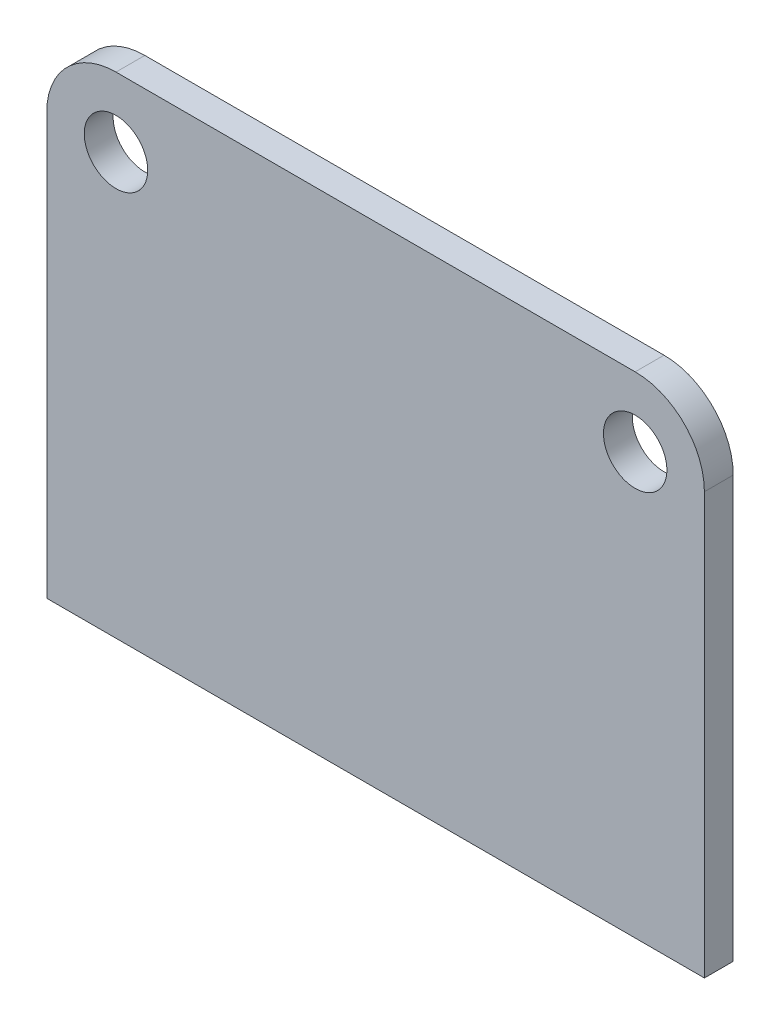
ISO-10303-21;
HEADER;
FILE_DESCRIPTION(('STEP AP214'),'2;1');
FILE_NAME('part.step','',(''),(''),'','','');
FILE_SCHEMA(('AUTOMOTIVE_DESIGN { 1 0 10303 214 1 1 1 1 }'));
ENDSEC;
DATA;
#1=APPLICATION_CONTEXT('core data for automotive mechanical design processes');
#2=APPLICATION_PROTOCOL_DEFINITION('international standard','automotive_design',2000,#1);
#3=PRODUCT_CONTEXT('',#1,'mechanical');
#4=PRODUCT('Part','Part','',(#3));
#5=PRODUCT_RELATED_PRODUCT_CATEGORY('part','',(#4));
#6=PRODUCT_DEFINITION_FORMATION('','',#4);
#7=PRODUCT_DEFINITION_CONTEXT('part definition',#1,'design');
#8=PRODUCT_DEFINITION('design','',#6,#7);
#9=PRODUCT_DEFINITION_SHAPE('','',#8);
#10=(LENGTH_UNIT() NAMED_UNIT(*) SI_UNIT(.MILLI.,.METRE.));
#11=(NAMED_UNIT(*) PLANE_ANGLE_UNIT() SI_UNIT($,.RADIAN.));
#12=(NAMED_UNIT(*) SI_UNIT($,.STERADIAN.) SOLID_ANGLE_UNIT());
#13=UNCERTAINTY_MEASURE_WITH_UNIT(LENGTH_MEASURE(1.E-05),#10,'distance_accuracy_value','');
#14=(GEOMETRIC_REPRESENTATION_CONTEXT(3) GLOBAL_UNCERTAINTY_ASSIGNED_CONTEXT((#13)) GLOBAL_UNIT_ASSIGNED_CONTEXT((#10,
#11,#12)) REPRESENTATION_CONTEXT('',''));
#15=CARTESIAN_POINT('',(0.,0.,0.));
#16=DIRECTION('',(0.,0.,1.));
#17=DIRECTION('',(1.,0.,0.));
#18=AXIS2_PLACEMENT_3D('',#15,#16,#17);
#19=CARTESIAN_POINT('',(9.,11.1,-0.5));
#20=DIRECTION('',(0.,0.,1.));
#21=DIRECTION('',(1.,0.,0.));
#22=AXIS2_PLACEMENT_3D('',#19,#20,#21);
#23=PLANE('',#22);
#24=DIRECTION('',(-1.,0.,0.));
#25=VECTOR('',#24,1.);
#26=CARTESIAN_POINT('',(11.4,-3.49999999999999,-0.5));
#27=LINE('',#26,#25);
#28=CARTESIAN_POINT('',(11.4,-3.49999999999999,-0.5));
#29=VERTEX_POINT('',#28);
#30=CARTESIAN_POINT('',(-11.4,-3.5,-0.5));
#31=VERTEX_POINT('',#30);
#32=EDGE_CURVE('E100',#29,#31,#27,.T.);
#33=ORIENTED_EDGE('',*,*,#32,.T.);
#34=DIRECTION('',(0.,1.,0.));
#35=VECTOR('',#34,1.);
#36=CARTESIAN_POINT('',(-11.4,-3.5,-0.5));
#37=LINE('',#36,#35);
#38=CARTESIAN_POINT('',(-11.4,11.1,-0.5));
#39=VERTEX_POINT('',#38);
#40=EDGE_CURVE('E111',#31,#39,#37,.T.);
#41=ORIENTED_EDGE('',*,*,#40,.T.);
#42=CARTESIAN_POINT('',(-9.,11.1,-0.5));
#43=DIRECTION('',(0.,0.,-1.));
#44=DIRECTION('',(-1.,0.,0.));
#45=AXIS2_PLACEMENT_3D('',#42,#43,#44);
#46=CIRCLE('',#45,2.4);
#47=CARTESIAN_POINT('',(-9.,13.5,-0.5));
#48=VERTEX_POINT('',#47);
#49=EDGE_CURVE('E83',#48,#39,#46,.F.);
#50=ORIENTED_EDGE('',*,*,#49,.F.);
#51=DIRECTION('',(1.,0.,0.));
#52=VECTOR('',#51,1.);
#53=CARTESIAN_POINT('',(9.,13.5,-0.5));
#54=LINE('',#53,#52);
#55=CARTESIAN_POINT('',(9.,13.5,-0.5));
#56=VERTEX_POINT('',#55);
#57=EDGE_CURVE('E79',#48,#56,#54,.T.);
#58=ORIENTED_EDGE('',*,*,#57,.T.);
#59=CARTESIAN_POINT('',(9.,11.1,-0.5));
#60=DIRECTION('',(0.,0.,-1.));
#61=DIRECTION('',(-1.,0.,0.));
#62=AXIS2_PLACEMENT_3D('',#59,#60,#61);
#63=CIRCLE('',#62,2.4);
#64=CARTESIAN_POINT('',(11.4,11.1,-0.5));
#65=VERTEX_POINT('',#64);
#66=EDGE_CURVE('E66',#65,#56,#63,.F.);
#67=ORIENTED_EDGE('',*,*,#66,.F.);
#68=DIRECTION('',(0.,-1.,0.));
#69=VECTOR('',#68,1.);
#70=CARTESIAN_POINT('',(11.4,-3.49999999999999,-0.5));
#71=LINE('',#70,#69);
#72=EDGE_CURVE('E76',#65,#29,#71,.T.);
#73=ORIENTED_EDGE('',*,*,#72,.T.);
#74=EDGE_LOOP('',(#33,#41,#50,#58,#67,#73));
#75=FACE_BOUND('',#74,.T.);
#76=CARTESIAN_POINT('',(9.,11.1,-0.5));
#77=DIRECTION('',(0.,0.,1.));
#78=DIRECTION('',(1.,0.,0.));
#79=AXIS2_PLACEMENT_3D('',#76,#77,#78);
#80=CIRCLE('',#79,1.1);
#81=CARTESIAN_POINT('',(10.1,11.1,-0.5));
#82=VERTEX_POINT('',#81);
#83=EDGE_CURVE('E104',#82,#82,#80,.T.);
#84=ORIENTED_EDGE('',*,*,#83,.T.);
#85=EDGE_LOOP('',(#84));
#86=FACE_BOUND('',#85,.T.);
#87=CARTESIAN_POINT('',(-9.,11.1,-0.5));
#88=DIRECTION('',(0.,0.,1.));
#89=DIRECTION('',(1.,0.,0.));
#90=AXIS2_PLACEMENT_3D('',#87,#88,#89);
#91=CIRCLE('',#90,1.1);
#92=CARTESIAN_POINT('',(-7.9,11.1,-0.5));
#93=VERTEX_POINT('',#92);
#94=EDGE_CURVE('E20',#93,#93,#91,.T.);
#95=ORIENTED_EDGE('',*,*,#94,.T.);
#96=EDGE_LOOP('',(#95));
#97=FACE_BOUND('',#96,.T.);
#98=ADVANCED_FACE('F17',(#75,#86,#97),#23,.F.);
#99=CARTESIAN_POINT('',(-9.,11.1,0.5));
#100=DIRECTION('',(0.,0.,1.));
#101=DIRECTION('',(1.,0.,0.));
#102=AXIS2_PLACEMENT_3D('',#99,#100,#101);
#103=CYLINDRICAL_SURFACE('',#102,1.1);
#104=ORIENTED_EDGE('',*,*,#94,.F.);
#105=EDGE_LOOP('',(#104));
#106=FACE_BOUND('',#105,.T.);
#107=CARTESIAN_POINT('',(-9.,11.1,0.5));
#108=DIRECTION('',(0.,0.,1.));
#109=DIRECTION('',(1.,0.,0.));
#110=AXIS2_PLACEMENT_3D('',#107,#108,#109);
#111=CIRCLE('',#110,1.1);
#112=CARTESIAN_POINT('',(-7.9,11.1,0.5));
#113=VERTEX_POINT('',#112);
#114=EDGE_CURVE('E108',#113,#113,#111,.F.);
#115=ORIENTED_EDGE('',*,*,#114,.F.);
#116=EDGE_LOOP('',(#115));
#117=FACE_BOUND('',#116,.T.);
#118=ADVANCED_FACE('F133',(#106,#117),#103,.F.);
#119=CARTESIAN_POINT('',(9.,11.1,0.5));
#120=DIRECTION('',(0.,0.,1.));
#121=DIRECTION('',(1.,0.,0.));
#122=AXIS2_PLACEMENT_3D('',#119,#120,#121);
#123=CYLINDRICAL_SURFACE('',#122,1.1);
#124=ORIENTED_EDGE('',*,*,#83,.F.);
#125=EDGE_LOOP('',(#124));
#126=FACE_BOUND('',#125,.T.);
#127=CARTESIAN_POINT('',(9.,11.1,0.5));
#128=DIRECTION('',(0.,0.,1.));
#129=DIRECTION('',(1.,0.,0.));
#130=AXIS2_PLACEMENT_3D('',#127,#128,#129);
#131=CIRCLE('',#130,1.1);
#132=CARTESIAN_POINT('',(10.1,11.1,0.5));
#133=VERTEX_POINT('',#132);
#134=EDGE_CURVE('E122',#133,#133,#131,.F.);
#135=ORIENTED_EDGE('',*,*,#134,.F.);
#136=EDGE_LOOP('',(#135));
#137=FACE_BOUND('',#136,.T.);
#138=ADVANCED_FACE('F136',(#126,#137),#123,.F.);
#139=CARTESIAN_POINT('',(11.4,-3.49999999999999,0.5));
#140=DIRECTION('',(-1.,0.,0.));
#141=DIRECTION('',(0.,-1.,0.));
#142=AXIS2_PLACEMENT_3D('',#139,#140,#141);
#143=PLANE('',#142);
#144=DIRECTION('',(0.,0.,-1.));
#145=VECTOR('',#144,1.);
#146=CARTESIAN_POINT('',(11.4,11.1,0.5));
#147=LINE('',#146,#145);
#148=CARTESIAN_POINT('',(11.4,11.1,0.5));
#149=VERTEX_POINT('',#148);
#150=EDGE_CURVE('E75',#149,#65,#147,.T.);
#151=ORIENTED_EDGE('',*,*,#150,.F.);
#152=DIRECTION('',(0.,1.,0.));
#153=VECTOR('',#152,1.);
#154=CARTESIAN_POINT('',(11.4,11.1,0.5));
#155=LINE('',#154,#153);
#156=CARTESIAN_POINT('',(11.4,-3.5,0.5));
#157=VERTEX_POINT('',#156);
#158=EDGE_CURVE('E121',#157,#149,#155,.T.);
#159=ORIENTED_EDGE('',*,*,#158,.F.);
#160=DIRECTION('',(0.,0.,1.));
#161=VECTOR('',#160,1.);
#162=CARTESIAN_POINT('',(11.4,-3.49999999999999,0.5));
#163=LINE('',#162,#161);
#164=EDGE_CURVE('E97',#157,#29,#163,.F.);
#165=ORIENTED_EDGE('',*,*,#164,.T.);
#166=ORIENTED_EDGE('',*,*,#72,.F.);
#167=EDGE_LOOP('',(#151,#159,#165,#166));
#168=FACE_BOUND('',#167,.T.);
#169=ADVANCED_FACE('F164',(#168),#143,.F.);
#170=CARTESIAN_POINT('',(9.,11.1,0.5));
#171=DIRECTION('',(0.,0.,-1.));
#172=DIRECTION('',(-1.,0.,0.));
#173=AXIS2_PLACEMENT_3D('',#170,#171,#172);
#174=CYLINDRICAL_SURFACE('',#173,2.4);
#175=CARTESIAN_POINT('',(9.,11.1,0.5));
#176=DIRECTION('',(0.,0.,-1.));
#177=DIRECTION('',(-1.,0.,0.));
#178=AXIS2_PLACEMENT_3D('',#175,#176,#177);
#179=CIRCLE('',#178,2.4);
#180=CARTESIAN_POINT('',(9.,13.5,0.5));
#181=VERTEX_POINT('',#180);
#182=EDGE_CURVE('E119',#149,#181,#179,.F.);
#183=ORIENTED_EDGE('',*,*,#182,.F.);
#184=ORIENTED_EDGE('',*,*,#150,.T.);
#185=ORIENTED_EDGE('',*,*,#66,.T.);
#186=DIRECTION('',(0.,0.,-1.));
#187=VECTOR('',#186,1.);
#188=CARTESIAN_POINT('',(9.,13.5,0.5));
#189=LINE('',#188,#187);
#190=EDGE_CURVE('E73',#56,#181,#189,.F.);
#191=ORIENTED_EDGE('',*,*,#190,.T.);
#192=EDGE_LOOP('',(#183,#184,#185,#191));
#193=FACE_BOUND('',#192,.T.);
#194=ADVANCED_FACE('F71',(#193),#174,.T.);
#195=CARTESIAN_POINT('',(9.,13.5,0.5));
#196=DIRECTION('',(0.,-1.,0.));
#197=DIRECTION('',(0.,0.,-1.));
#198=AXIS2_PLACEMENT_3D('',#195,#196,#197);
#199=PLANE('',#198);
#200=DIRECTION('',(0.,0.,-1.));
#201=VECTOR('',#200,1.);
#202=CARTESIAN_POINT('',(-9.,13.5,0.5));
#203=LINE('',#202,#201);
#204=CARTESIAN_POINT('',(-9.,13.5,0.5));
#205=VERTEX_POINT('',#204);
#206=EDGE_CURVE('E94',#205,#48,#203,.T.);
#207=ORIENTED_EDGE('',*,*,#206,.F.);
#208=DIRECTION('',(1.,0.,0.));
#209=VECTOR('',#208,1.);
#210=CARTESIAN_POINT('',(9.,13.5,0.5));
#211=LINE('',#210,#209);
#212=EDGE_CURVE('E89',#181,#205,#211,.F.);
#213=ORIENTED_EDGE('',*,*,#212,.F.);
#214=ORIENTED_EDGE('',*,*,#190,.F.);
#215=ORIENTED_EDGE('',*,*,#57,.F.);
#216=EDGE_LOOP('',(#207,#213,#214,#215));
#217=FACE_BOUND('',#216,.T.);
#218=ADVANCED_FACE('F87',(#217),#199,.F.);
#219=CARTESIAN_POINT('',(-9.,11.1,0.5));
#220=DIRECTION('',(0.,0.,-1.));
#221=DIRECTION('',(-1.,0.,0.));
#222=AXIS2_PLACEMENT_3D('',#219,#220,#221);
#223=CYLINDRICAL_SURFACE('',#222,2.4);
#224=CARTESIAN_POINT('',(-9.,11.1,0.5));
#225=DIRECTION('',(0.,0.,-1.));
#226=DIRECTION('',(-1.,0.,0.));
#227=AXIS2_PLACEMENT_3D('',#224,#225,#226);
#228=CIRCLE('',#227,2.4);
#229=CARTESIAN_POINT('',(-11.4,11.1,0.5));
#230=VERTEX_POINT('',#229);
#231=EDGE_CURVE('E116',#205,#230,#228,.F.);
#232=ORIENTED_EDGE('',*,*,#231,.F.);
#233=ORIENTED_EDGE('',*,*,#206,.T.);
#234=ORIENTED_EDGE('',*,*,#49,.T.);
#235=DIRECTION('',(0.,0.,1.));
#236=VECTOR('',#235,1.);
#237=CARTESIAN_POINT('',(-11.4,11.1,0.5));
#238=LINE('',#237,#236);
#239=EDGE_CURVE('E113',#39,#230,#238,.T.);
#240=ORIENTED_EDGE('',*,*,#239,.T.);
#241=EDGE_LOOP('',(#232,#233,#234,#240));
#242=FACE_BOUND('',#241,.T.);
#243=ADVANCED_FACE('F156',(#242),#223,.T.);
#244=CARTESIAN_POINT('',(-11.4,-3.5,0.5));
#245=DIRECTION('',(1.,0.,0.));
#246=DIRECTION('',(0.,1.,0.));
#247=AXIS2_PLACEMENT_3D('',#244,#245,#246);
#248=PLANE('',#247);
#249=DIRECTION('',(0.,0.,1.));
#250=VECTOR('',#249,1.);
#251=CARTESIAN_POINT('',(-11.4,-3.5,0.5));
#252=LINE('',#251,#250);
#253=CARTESIAN_POINT('',(-11.4,-3.5,0.5));
#254=VERTEX_POINT('',#253);
#255=EDGE_CURVE('E35',#31,#254,#252,.T.);
#256=ORIENTED_EDGE('',*,*,#255,.T.);
#257=DIRECTION('',(0.,1.,0.));
#258=VECTOR('',#257,1.);
#259=CARTESIAN_POINT('',(-11.4,11.1,0.5));
#260=LINE('',#259,#258);
#261=EDGE_CURVE('E26',#230,#254,#260,.F.);
#262=ORIENTED_EDGE('',*,*,#261,.F.);
#263=ORIENTED_EDGE('',*,*,#239,.F.);
#264=ORIENTED_EDGE('',*,*,#40,.F.);
#265=EDGE_LOOP('',(#256,#262,#263,#264));
#266=FACE_BOUND('',#265,.T.);
#267=ADVANCED_FACE('F148',(#266),#248,.F.);
#268=CARTESIAN_POINT('',(11.4,-3.49999999999999,0.5));
#269=DIRECTION('',(0.,1.,0.));
#270=DIRECTION('',(-1.,0.,0.));
#271=AXIS2_PLACEMENT_3D('',#268,#269,#270);
#272=PLANE('',#271);
#273=ORIENTED_EDGE('',*,*,#164,.F.);
#274=DIRECTION('',(1.,0.,0.));
#275=VECTOR('',#274,1.);
#276=CARTESIAN_POINT('',(9.,-3.5,0.5));
#277=LINE('',#276,#275);
#278=EDGE_CURVE('E11',#254,#157,#277,.T.);
#279=ORIENTED_EDGE('',*,*,#278,.F.);
#280=ORIENTED_EDGE('',*,*,#255,.F.);
#281=ORIENTED_EDGE('',*,*,#32,.F.);
#282=EDGE_LOOP('',(#273,#279,#280,#281));
#283=FACE_BOUND('',#282,.T.);
#284=ADVANCED_FACE('F141',(#283),#272,.F.);
#285=CARTESIAN_POINT('',(9.,11.1,0.5));
#286=DIRECTION('',(0.,0.,1.));
#287=DIRECTION('',(1.,0.,0.));
#288=AXIS2_PLACEMENT_3D('',#285,#286,#287);
#289=PLANE('',#288);
#290=ORIENTED_EDGE('',*,*,#261,.T.);
#291=ORIENTED_EDGE('',*,*,#278,.T.);
#292=ORIENTED_EDGE('',*,*,#158,.T.);
#293=ORIENTED_EDGE('',*,*,#182,.T.);
#294=ORIENTED_EDGE('',*,*,#212,.T.);
#295=ORIENTED_EDGE('',*,*,#231,.T.);
#296=EDGE_LOOP('',(#290,#291,#292,#293,#294,#295));
#297=FACE_BOUND('',#296,.T.);
#298=ORIENTED_EDGE('',*,*,#134,.T.);
#299=EDGE_LOOP('',(#298));
#300=FACE_BOUND('',#299,.T.);
#301=ORIENTED_EDGE('',*,*,#114,.T.);
#302=EDGE_LOOP('',(#301));
#303=FACE_BOUND('',#302,.T.);
#304=ADVANCED_FACE('F139',(#297,#300,#303),#289,.T.);
#305=CLOSED_SHELL('',(#98,#118,#138,#169,#194,#218,#243,#267,#284,#304));
#306=MANIFOLD_SOLID_BREP('B1',#305);
#307=ADVANCED_BREP_SHAPE_REPRESENTATION('',(#18,#306),#14);
#308=SHAPE_DEFINITION_REPRESENTATION(#9,#307);
ENDSEC;
END-ISO-10303-21;
